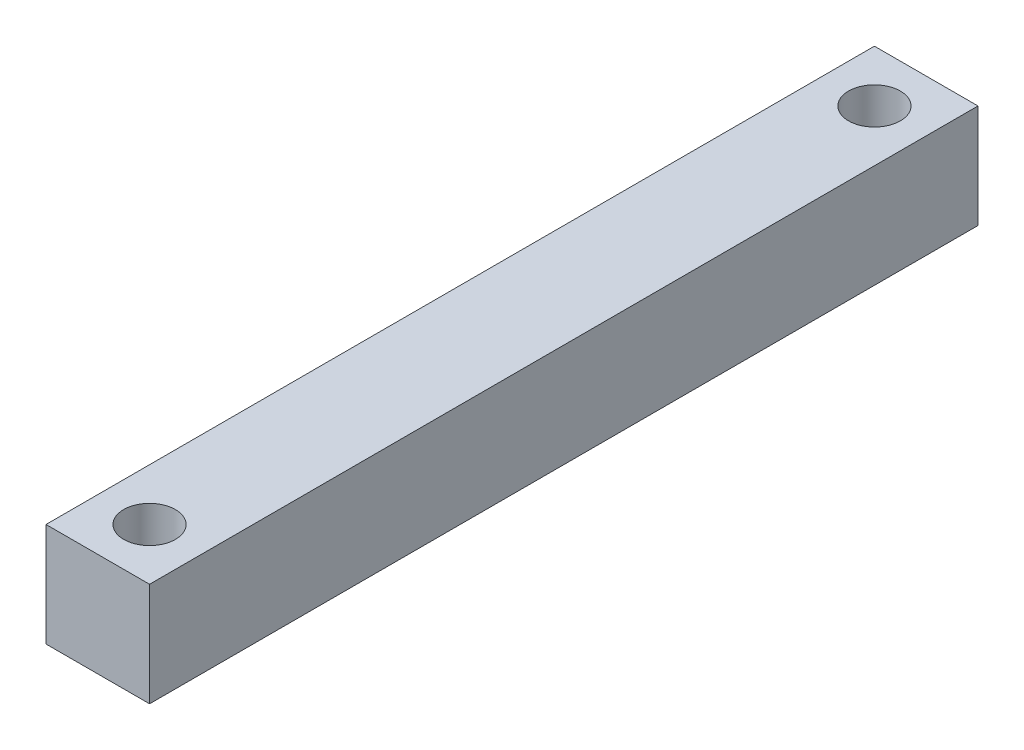
ISO-10303-21;
HEADER;
FILE_DESCRIPTION(('STEP AP214'),'2;1');
FILE_NAME('part.step','',(''),(''),'','','');
FILE_SCHEMA(('AUTOMOTIVE_DESIGN { 1 0 10303 214 1 1 1 1 }'));
ENDSEC;
DATA;
#1=APPLICATION_CONTEXT('core data for automotive mechanical design processes');
#2=APPLICATION_PROTOCOL_DEFINITION('international standard','automotive_design',2000,#1);
#3=PRODUCT_CONTEXT('',#1,'mechanical');
#4=PRODUCT('Part','Part','',(#3));
#5=PRODUCT_RELATED_PRODUCT_CATEGORY('part','',(#4));
#6=PRODUCT_DEFINITION_FORMATION('','',#4);
#7=PRODUCT_DEFINITION_CONTEXT('part definition',#1,'design');
#8=PRODUCT_DEFINITION('design','',#6,#7);
#9=PRODUCT_DEFINITION_SHAPE('','',#8);
#10=(LENGTH_UNIT() NAMED_UNIT(*) SI_UNIT(.MILLI.,.METRE.));
#11=(NAMED_UNIT(*) PLANE_ANGLE_UNIT() SI_UNIT($,.RADIAN.));
#12=(NAMED_UNIT(*) SI_UNIT($,.STERADIAN.) SOLID_ANGLE_UNIT());
#13=UNCERTAINTY_MEASURE_WITH_UNIT(LENGTH_MEASURE(1.E-05),#10,'distance_accuracy_value','');
#14=(GEOMETRIC_REPRESENTATION_CONTEXT(3) GLOBAL_UNCERTAINTY_ASSIGNED_CONTEXT((#13)) GLOBAL_UNIT_ASSIGNED_CONTEXT((#10,
#11,#12)) REPRESENTATION_CONTEXT('',''));
#15=CARTESIAN_POINT('',(0.,0.,0.));
#16=DIRECTION('',(0.,0.,1.));
#17=DIRECTION('',(1.,0.,0.));
#18=AXIS2_PLACEMENT_3D('',#15,#16,#17);
#19=CARTESIAN_POINT('',(5.,5.,40.));
#20=DIRECTION('',(-1.,0.,0.));
#21=DIRECTION('',(0.,0.,1.));
#22=AXIS2_PLACEMENT_3D('',#19,#20,#21);
#23=PLANE('',#22);
#24=DIRECTION('',(0.,1.,0.));
#25=VECTOR('',#24,1.);
#26=CARTESIAN_POINT('',(5.,5.,-40.));
#27=LINE('',#26,#25);
#28=CARTESIAN_POINT('',(5.,-5.,-40.));
#29=VERTEX_POINT('',#28);
#30=CARTESIAN_POINT('',(5.,5.,-40.));
#31=VERTEX_POINT('',#30);
#32=EDGE_CURVE('E107',#29,#31,#27,.T.);
#33=ORIENTED_EDGE('',*,*,#32,.T.);
#34=DIRECTION('',(0.,0.,-1.));
#35=VECTOR('',#34,1.);
#36=CARTESIAN_POINT('',(5.,5.,40.));
#37=LINE('',#36,#35);
#38=CARTESIAN_POINT('',(5.,5.,40.));
#39=VERTEX_POINT('',#38);
#40=EDGE_CURVE('E11',#39,#31,#37,.T.);
#41=ORIENTED_EDGE('',*,*,#40,.F.);
#42=DIRECTION('',(0.,1.,0.));
#43=VECTOR('',#42,1.);
#44=CARTESIAN_POINT('',(5.,5.,40.));
#45=LINE('',#44,#43);
#46=CARTESIAN_POINT('',(5.,-5.,40.));
#47=VERTEX_POINT('',#46);
#48=EDGE_CURVE('E91',#47,#39,#45,.T.);
#49=ORIENTED_EDGE('',*,*,#48,.F.);
#50=DIRECTION('',(0.,0.,-1.));
#51=VECTOR('',#50,1.);
#52=CARTESIAN_POINT('',(5.,-5.,40.));
#53=LINE('',#52,#51);
#54=EDGE_CURVE('E103',#47,#29,#53,.T.);
#55=ORIENTED_EDGE('',*,*,#54,.T.);
#56=EDGE_LOOP('',(#33,#41,#49,#55));
#57=FACE_BOUND('',#56,.T.);
#58=ADVANCED_FACE('F39',(#57),#23,.F.);
#59=CARTESIAN_POINT('',(-5.,5.,40.));
#60=DIRECTION('',(0.,-1.,0.));
#61=DIRECTION('',(0.,0.,-1.));
#62=AXIS2_PLACEMENT_3D('',#59,#60,#61);
#63=PLANE('',#62);
#64=CARTESIAN_POINT('',(0.,5.,35.));
#65=DIRECTION('',(0.,1.,0.));
#66=DIRECTION('',(0.,0.,1.));
#67=AXIS2_PLACEMENT_3D('',#64,#65,#66);
#68=CIRCLE('',#67,2.5);
#69=CARTESIAN_POINT('',(0.,5.,37.5));
#70=VERTEX_POINT('',#69);
#71=EDGE_CURVE('E132',#70,#70,#68,.T.);
#72=ORIENTED_EDGE('',*,*,#71,.F.);
#73=EDGE_LOOP('',(#72));
#74=FACE_BOUND('',#73,.T.);
#75=CARTESIAN_POINT('',(0.,5.,-35.));
#76=DIRECTION('',(0.,1.,0.));
#77=DIRECTION('',(0.,0.,-1.));
#78=AXIS2_PLACEMENT_3D('',#75,#76,#77);
#79=CIRCLE('',#78,2.5);
#80=CARTESIAN_POINT('',(0.,5.,-37.5));
#81=VERTEX_POINT('',#80);
#82=EDGE_CURVE('E133',#81,#81,#79,.T.);
#83=ORIENTED_EDGE('',*,*,#82,.F.);
#84=EDGE_LOOP('',(#83));
#85=FACE_BOUND('',#84,.T.);
#86=DIRECTION('',(-1.,0.,0.));
#87=VECTOR('',#86,1.);
#88=CARTESIAN_POINT('',(-5.,5.,-40.));
#89=LINE('',#88,#87);
#90=CARTESIAN_POINT('',(-5.,5.,-40.));
#91=VERTEX_POINT('',#90);
#92=EDGE_CURVE('E96',#31,#91,#89,.T.);
#93=ORIENTED_EDGE('',*,*,#92,.T.);
#94=DIRECTION('',(0.,0.,-1.));
#95=VECTOR('',#94,1.);
#96=CARTESIAN_POINT('',(-5.,5.,40.));
#97=LINE('',#96,#95);
#98=CARTESIAN_POINT('',(-5.,5.,40.));
#99=VERTEX_POINT('',#98);
#100=EDGE_CURVE('E48',#99,#91,#97,.T.);
#101=ORIENTED_EDGE('',*,*,#100,.F.);
#102=DIRECTION('',(-1.,0.,0.));
#103=VECTOR('',#102,1.);
#104=CARTESIAN_POINT('',(-5.,5.,40.));
#105=LINE('',#104,#103);
#106=EDGE_CURVE('E86',#39,#99,#105,.T.);
#107=ORIENTED_EDGE('',*,*,#106,.F.);
#108=ORIENTED_EDGE('',*,*,#40,.T.);
#109=EDGE_LOOP('',(#93,#101,#107,#108));
#110=FACE_BOUND('',#109,.T.);
#111=ADVANCED_FACE('F95',(#74,#85,#110),#63,.F.);
#112=CARTESIAN_POINT('',(-5.,5.,40.));
#113=DIRECTION('',(1.,0.,0.));
#114=DIRECTION('',(0.,1.,0.));
#115=AXIS2_PLACEMENT_3D('',#112,#113,#114);
#116=PLANE('',#115);
#117=DIRECTION('',(0.,-1.,0.));
#118=VECTOR('',#117,1.);
#119=CARTESIAN_POINT('',(-5.,5.,-40.));
#120=LINE('',#119,#118);
#121=CARTESIAN_POINT('',(-5.,-5.,-40.));
#122=VERTEX_POINT('',#121);
#123=EDGE_CURVE('E73',#91,#122,#120,.T.);
#124=ORIENTED_EDGE('',*,*,#123,.T.);
#125=DIRECTION('',(0.,0.,-1.));
#126=VECTOR('',#125,1.);
#127=CARTESIAN_POINT('',(-5.,-5.,40.));
#128=LINE('',#127,#126);
#129=CARTESIAN_POINT('',(-5.,-5.,40.));
#130=VERTEX_POINT('',#129);
#131=EDGE_CURVE('E98',#130,#122,#128,.T.);
#132=ORIENTED_EDGE('',*,*,#131,.F.);
#133=DIRECTION('',(0.,-1.,0.));
#134=VECTOR('',#133,1.);
#135=CARTESIAN_POINT('',(-5.,5.,40.));
#136=LINE('',#135,#134);
#137=EDGE_CURVE('E89',#99,#130,#136,.T.);
#138=ORIENTED_EDGE('',*,*,#137,.F.);
#139=ORIENTED_EDGE('',*,*,#100,.T.);
#140=EDGE_LOOP('',(#124,#132,#138,#139));
#141=FACE_BOUND('',#140,.T.);
#142=ADVANCED_FACE('F99',(#141),#116,.F.);
#143=CARTESIAN_POINT('',(-5.,-5.,40.));
#144=DIRECTION('',(0.,1.,0.));
#145=DIRECTION('',(0.,0.,1.));
#146=AXIS2_PLACEMENT_3D('',#143,#144,#145);
#147=PLANE('',#146);
#148=CARTESIAN_POINT('',(0.,-5.,35.));
#149=DIRECTION('',(0.,1.,0.));
#150=DIRECTION('',(0.,0.,1.));
#151=AXIS2_PLACEMENT_3D('',#148,#149,#150);
#152=CIRCLE('',#151,2.5);
#153=CARTESIAN_POINT('',(0.,-5.,37.5));
#154=VERTEX_POINT('',#153);
#155=EDGE_CURVE('E111',#154,#154,#152,.T.);
#156=ORIENTED_EDGE('',*,*,#155,.T.);
#157=EDGE_LOOP('',(#156));
#158=FACE_BOUND('',#157,.T.);
#159=CARTESIAN_POINT('',(0.,-5.,-35.));
#160=DIRECTION('',(0.,1.,0.));
#161=DIRECTION('',(0.,0.,-1.));
#162=AXIS2_PLACEMENT_3D('',#159,#160,#161);
#163=CIRCLE('',#162,2.5);
#164=CARTESIAN_POINT('',(0.,-5.,-37.5));
#165=VERTEX_POINT('',#164);
#166=EDGE_CURVE('E128',#165,#165,#163,.T.);
#167=ORIENTED_EDGE('',*,*,#166,.T.);
#168=EDGE_LOOP('',(#167));
#169=FACE_BOUND('',#168,.T.);
#170=DIRECTION('',(1.,0.,0.));
#171=VECTOR('',#170,1.);
#172=CARTESIAN_POINT('',(-5.,-5.,-40.));
#173=LINE('',#172,#171);
#174=EDGE_CURVE('E79',#122,#29,#173,.T.);
#175=ORIENTED_EDGE('',*,*,#174,.T.);
#176=ORIENTED_EDGE('',*,*,#54,.F.);
#177=DIRECTION('',(1.,0.,0.));
#178=VECTOR('',#177,1.);
#179=CARTESIAN_POINT('',(-5.,-5.,40.));
#180=LINE('',#179,#178);
#181=EDGE_CURVE('E56',#130,#47,#180,.T.);
#182=ORIENTED_EDGE('',*,*,#181,.F.);
#183=ORIENTED_EDGE('',*,*,#131,.T.);
#184=EDGE_LOOP('',(#175,#176,#182,#183));
#185=FACE_BOUND('',#184,.T.);
#186=ADVANCED_FACE('F121',(#158,#169,#185),#147,.F.);
#187=CARTESIAN_POINT('',(0.,0.,40.));
#188=DIRECTION('',(0.,0.,1.));
#189=DIRECTION('',(1.,0.,0.));
#190=AXIS2_PLACEMENT_3D('',#187,#188,#189);
#191=PLANE('',#190);
#192=ORIENTED_EDGE('',*,*,#48,.T.);
#193=ORIENTED_EDGE('',*,*,#106,.T.);
#194=ORIENTED_EDGE('',*,*,#137,.T.);
#195=ORIENTED_EDGE('',*,*,#181,.T.);
#196=EDGE_LOOP('',(#192,#193,#194,#195));
#197=FACE_BOUND('',#196,.T.);
#198=ADVANCED_FACE('F87',(#197),#191,.T.);
#199=CARTESIAN_POINT('',(0.,0.,-40.));
#200=DIRECTION('',(0.,0.,1.));
#201=DIRECTION('',(1.,0.,0.));
#202=AXIS2_PLACEMENT_3D('',#199,#200,#201);
#203=PLANE('',#202);
#204=ORIENTED_EDGE('',*,*,#32,.F.);
#205=ORIENTED_EDGE('',*,*,#174,.F.);
#206=ORIENTED_EDGE('',*,*,#123,.F.);
#207=ORIENTED_EDGE('',*,*,#92,.F.);
#208=EDGE_LOOP('',(#204,#205,#206,#207));
#209=FACE_BOUND('',#208,.T.);
#210=ADVANCED_FACE('F124',(#209),#203,.F.);
#211=CARTESIAN_POINT('',(0.,-5.,-35.));
#212=DIRECTION('',(0.,1.,0.));
#213=DIRECTION('',(0.,0.,1.));
#214=AXIS2_PLACEMENT_3D('',#211,#212,#213);
#215=CYLINDRICAL_SURFACE('',#214,2.5);
#216=ORIENTED_EDGE('',*,*,#166,.F.);
#217=EDGE_LOOP('',(#216));
#218=FACE_BOUND('',#217,.T.);
#219=ORIENTED_EDGE('',*,*,#82,.T.);
#220=EDGE_LOOP('',(#219));
#221=FACE_BOUND('',#220,.T.);
#222=ADVANCED_FACE('F150',(#218,#221),#215,.F.);
#223=CARTESIAN_POINT('',(0.,-5.,35.));
#224=DIRECTION('',(0.,1.,0.));
#225=DIRECTION('',(0.,0.,1.));
#226=AXIS2_PLACEMENT_3D('',#223,#224,#225);
#227=CYLINDRICAL_SURFACE('',#226,2.5);
#228=ORIENTED_EDGE('',*,*,#155,.F.);
#229=EDGE_LOOP('',(#228));
#230=FACE_BOUND('',#229,.T.);
#231=ORIENTED_EDGE('',*,*,#71,.T.);
#232=EDGE_LOOP('',(#231));
#233=FACE_BOUND('',#232,.T.);
#234=ADVANCED_FACE('F144',(#230,#233),#227,.F.);
#235=CLOSED_SHELL('',(#58,#111,#142,#186,#198,#210,#222,#234));
#236=MANIFOLD_SOLID_BREP('B2',#235);
#237=ADVANCED_BREP_SHAPE_REPRESENTATION('',(#18,#236),#14);
#238=SHAPE_DEFINITION_REPRESENTATION(#9,#237);
ENDSEC;
END-ISO-10303-21;
